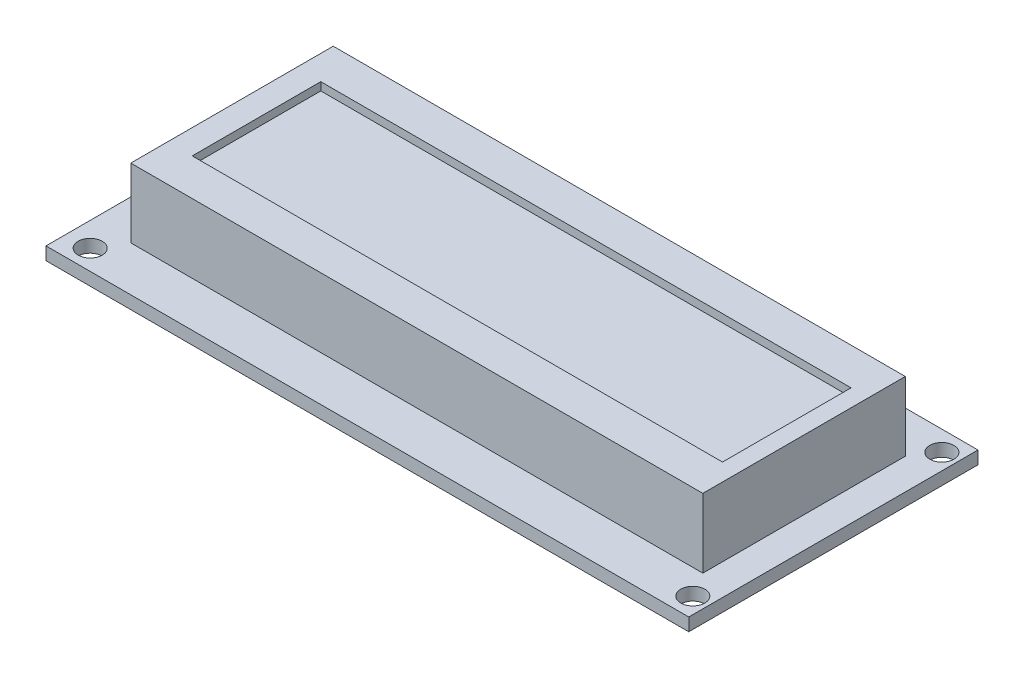
ISO-10303-21;
HEADER;
FILE_DESCRIPTION(('STEP AP214'),'2;1');
FILE_NAME('part.step','',(''),(''),'','','');
FILE_SCHEMA(('AUTOMOTIVE_DESIGN { 1 0 10303 214 1 1 1 1 }'));
ENDSEC;
DATA;
#1=APPLICATION_CONTEXT('core data for automotive mechanical design processes');
#2=APPLICATION_PROTOCOL_DEFINITION('international standard','automotive_design',2000,#1);
#3=PRODUCT_CONTEXT('',#1,'mechanical');
#4=PRODUCT('Part','Part','',(#3));
#5=PRODUCT_RELATED_PRODUCT_CATEGORY('part','',(#4));
#6=PRODUCT_DEFINITION_FORMATION('','',#4);
#7=PRODUCT_DEFINITION_CONTEXT('part definition',#1,'design');
#8=PRODUCT_DEFINITION('design','',#6,#7);
#9=PRODUCT_DEFINITION_SHAPE('','',#8);
#10=(LENGTH_UNIT() NAMED_UNIT(*) SI_UNIT(.MILLI.,.METRE.));
#11=(NAMED_UNIT(*) PLANE_ANGLE_UNIT() SI_UNIT($,.RADIAN.));
#12=(NAMED_UNIT(*) SI_UNIT($,.STERADIAN.) SOLID_ANGLE_UNIT());
#13=UNCERTAINTY_MEASURE_WITH_UNIT(LENGTH_MEASURE(1.E-05),#10,'distance_accuracy_value','');
#14=(GEOMETRIC_REPRESENTATION_CONTEXT(3) GLOBAL_UNCERTAINTY_ASSIGNED_CONTEXT((#13)) GLOBAL_UNIT_ASSIGNED_CONTEXT((#10,
#11,#12)) REPRESENTATION_CONTEXT('',''));
#15=CARTESIAN_POINT('',(0.,0.,0.));
#16=DIRECTION('',(0.,0.,1.));
#17=DIRECTION('',(1.,0.,0.));
#18=AXIS2_PLACEMENT_3D('',#15,#16,#17);
#19=CARTESIAN_POINT('',(0.,1.6,0.));
#20=DIRECTION('',(0.,1.,0.));
#21=DIRECTION('',(0.,0.,1.));
#22=AXIS2_PLACEMENT_3D('',#19,#20,#21);
#23=PLANE('',#22);
#24=CARTESIAN_POINT('',(9.38767123287673,1.6,-25.7191780821918));
#25=DIRECTION('',(0.,1.,0.));
#26=DIRECTION('',(0.,0.,1.));
#27=AXIS2_PLACEMENT_3D('',#24,#25,#26);
#28=CIRCLE('',#27,0.499999999999999);
#29=CARTESIAN_POINT('',(9.38767123287673,1.6,-25.2191780821918));
#30=VERTEX_POINT('',#29);
#31=EDGE_CURVE('E312',#30,#30,#28,.T.);
#32=ORIENTED_EDGE('',*,*,#31,.F.);
#33=EDGE_LOOP('',(#32));
#34=FACE_BOUND('',#33,.T.);
#35=CARTESIAN_POINT('',(6.84767123287673,1.6,-25.7191780821918));
#36=DIRECTION('',(0.,1.,0.));
#37=DIRECTION('',(0.,0.,1.));
#38=AXIS2_PLACEMENT_3D('',#35,#36,#37);
#39=CIRCLE('',#38,0.499999999999999);
#40=CARTESIAN_POINT('',(6.84767123287673,1.6,-25.2191780821918));
#41=VERTEX_POINT('',#40);
#42=EDGE_CURVE('E302',#41,#41,#39,.T.);
#43=ORIENTED_EDGE('',*,*,#42,.F.);
#44=EDGE_LOOP('',(#43));
#45=FACE_BOUND('',#44,.T.);
#46=CARTESIAN_POINT('',(4.30767123287673,1.6,-25.7191780821918));
#47=DIRECTION('',(0.,1.,0.));
#48=DIRECTION('',(0.,0.,1.));
#49=AXIS2_PLACEMENT_3D('',#46,#47,#48);
#50=CIRCLE('',#49,0.499999999999999);
#51=CARTESIAN_POINT('',(4.30767123287673,1.6,-25.2191780821918));
#52=VERTEX_POINT('',#51);
#53=EDGE_CURVE('E299',#52,#52,#50,.T.);
#54=ORIENTED_EDGE('',*,*,#53,.F.);
#55=EDGE_LOOP('',(#54));
#56=FACE_BOUND('',#55,.T.);
#57=CARTESIAN_POINT('',(1.76767123287673,1.6,-25.7191780821918));
#58=DIRECTION('',(0.,1.,0.));
#59=DIRECTION('',(0.,0.,1.));
#60=AXIS2_PLACEMENT_3D('',#57,#58,#59);
#61=CIRCLE('',#60,0.499999999999999);
#62=CARTESIAN_POINT('',(1.76767123287673,1.6,-25.2191780821918));
#63=VERTEX_POINT('',#62);
#64=EDGE_CURVE('E296',#63,#63,#61,.T.);
#65=ORIENTED_EDGE('',*,*,#64,.F.);
#66=EDGE_LOOP('',(#65));
#67=FACE_BOUND('',#66,.T.);
#68=CARTESIAN_POINT('',(-0.772328767123267,1.6,-25.7191780821918));
#69=DIRECTION('',(0.,1.,0.));
#70=DIRECTION('',(0.,0.,1.));
#71=AXIS2_PLACEMENT_3D('',#68,#69,#70);
#72=CIRCLE('',#71,0.499999999999999);
#73=CARTESIAN_POINT('',(-0.772328767123267,1.6,-25.2191780821918));
#74=VERTEX_POINT('',#73);
#75=EDGE_CURVE('E292',#74,#74,#72,.T.);
#76=ORIENTED_EDGE('',*,*,#75,.F.);
#77=EDGE_LOOP('',(#76));
#78=FACE_BOUND('',#77,.T.);
#79=CARTESIAN_POINT('',(-3.31232876712327,1.6,-25.7191780821918));
#80=DIRECTION('',(0.,1.,0.));
#81=DIRECTION('',(0.,0.,1.));
#82=AXIS2_PLACEMENT_3D('',#79,#80,#81);
#83=CIRCLE('',#82,0.499999999999999);
#84=CARTESIAN_POINT('',(-3.31232876712327,1.6,-25.2191780821918));
#85=VERTEX_POINT('',#84);
#86=EDGE_CURVE('E288',#85,#85,#83,.T.);
#87=ORIENTED_EDGE('',*,*,#86,.F.);
#88=EDGE_LOOP('',(#87));
#89=FACE_BOUND('',#88,.T.);
#90=CARTESIAN_POINT('',(-5.85232876712327,1.6,-25.7191780821918));
#91=DIRECTION('',(0.,1.,0.));
#92=DIRECTION('',(0.,0.,1.));
#93=AXIS2_PLACEMENT_3D('',#90,#91,#92);
#94=CIRCLE('',#93,0.499999999999999);
#95=CARTESIAN_POINT('',(-5.85232876712327,1.6,-25.2191780821918));
#96=VERTEX_POINT('',#95);
#97=EDGE_CURVE('E284',#96,#96,#94,.T.);
#98=ORIENTED_EDGE('',*,*,#97,.F.);
#99=EDGE_LOOP('',(#98));
#100=FACE_BOUND('',#99,.T.);
#101=CARTESIAN_POINT('',(-8.39232876712327,1.6,-25.7191780821918));
#102=DIRECTION('',(0.,1.,0.));
#103=DIRECTION('',(0.,0.,1.));
#104=AXIS2_PLACEMENT_3D('',#101,#102,#103);
#105=CIRCLE('',#104,0.499999999999999);
#106=CARTESIAN_POINT('',(-8.39232876712327,1.6,-25.2191780821918));
#107=VERTEX_POINT('',#106);
#108=EDGE_CURVE('E280',#107,#107,#105,.T.);
#109=ORIENTED_EDGE('',*,*,#108,.F.);
#110=EDGE_LOOP('',(#109));
#111=FACE_BOUND('',#110,.T.);
#112=CARTESIAN_POINT('',(-10.9323287671233,1.6,-25.7191780821918));
#113=DIRECTION('',(0.,1.,0.));
#114=DIRECTION('',(0.,0.,1.));
#115=AXIS2_PLACEMENT_3D('',#112,#113,#114);
#116=CIRCLE('',#115,0.499999999999999);
#117=CARTESIAN_POINT('',(-10.9323287671233,1.6,-25.2191780821918));
#118=VERTEX_POINT('',#117);
#119=EDGE_CURVE('E276',#118,#118,#116,.T.);
#120=ORIENTED_EDGE('',*,*,#119,.F.);
#121=EDGE_LOOP('',(#120));
#122=FACE_BOUND('',#121,.T.);
#123=CARTESIAN_POINT('',(-13.4723287671233,1.6,-25.7191780821918));
#124=DIRECTION('',(0.,1.,0.));
#125=DIRECTION('',(0.,0.,1.));
#126=AXIS2_PLACEMENT_3D('',#123,#124,#125);
#127=CIRCLE('',#126,0.499999999999999);
#128=CARTESIAN_POINT('',(-13.4723287671233,1.6,-25.2191780821918));
#129=VERTEX_POINT('',#128);
#130=EDGE_CURVE('E272',#129,#129,#127,.T.);
#131=ORIENTED_EDGE('',*,*,#130,.F.);
#132=EDGE_LOOP('',(#131));
#133=FACE_BOUND('',#132,.T.);
#134=CARTESIAN_POINT('',(-16.0123287671233,1.6,-25.7191780821918));
#135=DIRECTION('',(0.,1.,0.));
#136=DIRECTION('',(0.,0.,1.));
#137=AXIS2_PLACEMENT_3D('',#134,#135,#136);
#138=CIRCLE('',#137,0.499999999999998);
#139=CARTESIAN_POINT('',(-16.0123287671233,1.6,-25.2191780821918));
#140=VERTEX_POINT('',#139);
#141=EDGE_CURVE('E268',#140,#140,#138,.T.);
#142=ORIENTED_EDGE('',*,*,#141,.F.);
#143=EDGE_LOOP('',(#142));
#144=FACE_BOUND('',#143,.T.);
#145=CARTESIAN_POINT('',(-18.5523287671233,1.6,-25.7191780821918));
#146=DIRECTION('',(0.,1.,0.));
#147=DIRECTION('',(0.,0.,1.));
#148=AXIS2_PLACEMENT_3D('',#145,#146,#147);
#149=CIRCLE('',#148,0.499999999999999);
#150=CARTESIAN_POINT('',(-18.5523287671233,1.6,-25.2191780821918));
#151=VERTEX_POINT('',#150);
#152=EDGE_CURVE('E264',#151,#151,#149,.T.);
#153=ORIENTED_EDGE('',*,*,#152,.F.);
#154=EDGE_LOOP('',(#153));
#155=FACE_BOUND('',#154,.T.);
#156=CARTESIAN_POINT('',(-21.0923287671233,1.6,-25.7191780821918));
#157=DIRECTION('',(0.,1.,0.));
#158=DIRECTION('',(0.,0.,1.));
#159=AXIS2_PLACEMENT_3D('',#156,#157,#158);
#160=CIRCLE('',#159,0.499999999999999);
#161=CARTESIAN_POINT('',(-21.0923287671233,1.6,-25.2191780821918));
#162=VERTEX_POINT('',#161);
#163=EDGE_CURVE('E260',#162,#162,#160,.T.);
#164=ORIENTED_EDGE('',*,*,#163,.F.);
#165=EDGE_LOOP('',(#164));
#166=FACE_BOUND('',#165,.T.);
#167=CARTESIAN_POINT('',(-23.6323287671233,1.6,-25.7191780821918));
#168=DIRECTION('',(0.,1.,0.));
#169=DIRECTION('',(0.,0.,1.));
#170=AXIS2_PLACEMENT_3D('',#167,#168,#169);
#171=CIRCLE('',#170,0.499999999999999);
#172=CARTESIAN_POINT('',(-23.6323287671233,1.6,-25.2191780821918));
#173=VERTEX_POINT('',#172);
#174=EDGE_CURVE('E256',#173,#173,#171,.T.);
#175=ORIENTED_EDGE('',*,*,#174,.F.);
#176=EDGE_LOOP('',(#175));
#177=FACE_BOUND('',#176,.T.);
#178=CARTESIAN_POINT('',(-26.1723287671233,1.6,-25.7191780821918));
#179=DIRECTION('',(0.,1.,0.));
#180=DIRECTION('',(0.,0.,1.));
#181=AXIS2_PLACEMENT_3D('',#178,#179,#180);
#182=CIRCLE('',#181,0.499999999999999);
#183=CARTESIAN_POINT('',(-26.1723287671233,1.6,-25.2191780821918));
#184=VERTEX_POINT('',#183);
#185=EDGE_CURVE('E252',#184,#184,#182,.T.);
#186=ORIENTED_EDGE('',*,*,#185,.F.);
#187=EDGE_LOOP('',(#186));
#188=FACE_BOUND('',#187,.T.);
#189=CARTESIAN_POINT('',(-28.7123287671233,1.6,-25.7191780821918));
#190=DIRECTION('',(0.,1.,0.));
#191=DIRECTION('',(0.,0.,1.));
#192=AXIS2_PLACEMENT_3D('',#189,#190,#191);
#193=CIRCLE('',#192,0.499999999999999);
#194=CARTESIAN_POINT('',(-28.7123287671233,1.6,-25.2191780821918));
#195=VERTEX_POINT('',#194);
#196=EDGE_CURVE('E154',#195,#195,#193,.T.);
#197=ORIENTED_EDGE('',*,*,#196,.F.);
#198=EDGE_LOOP('',(#197));
#199=FACE_BOUND('',#198,.T.);
#200=CARTESIAN_POINT('',(41.2876712328767,1.6,5.2808219178082));
#201=DIRECTION('',(0.,1.,0.));
#202=DIRECTION('',(0.,0.,1.));
#203=AXIS2_PLACEMENT_3D('',#200,#201,#202);
#204=CIRCLE('',#203,1.5);
#205=CARTESIAN_POINT('',(41.2876712328767,1.6,6.7808219178082));
#206=VERTEX_POINT('',#205);
#207=EDGE_CURVE('E167',#206,#206,#204,.T.);
#208=ORIENTED_EDGE('',*,*,#207,.F.);
#209=EDGE_LOOP('',(#208));
#210=FACE_BOUND('',#209,.T.);
#211=CARTESIAN_POINT('',(-33.7123287671233,1.6,5.2808219178082));
#212=DIRECTION('',(0.,1.,0.));
#213=DIRECTION('',(0.,0.,1.));
#214=AXIS2_PLACEMENT_3D('',#211,#212,#213);
#215=CIRCLE('',#214,1.5);
#216=CARTESIAN_POINT('',(-33.7123287671233,1.6,6.7808219178082));
#217=VERTEX_POINT('',#216);
#218=EDGE_CURVE('E174',#217,#217,#215,.T.);
#219=ORIENTED_EDGE('',*,*,#218,.F.);
#220=EDGE_LOOP('',(#219));
#221=FACE_BOUND('',#220,.T.);
#222=CARTESIAN_POINT('',(41.2876712328767,1.6,-25.7191780821918));
#223=DIRECTION('',(0.,1.,0.));
#224=DIRECTION('',(0.,0.,1.));
#225=AXIS2_PLACEMENT_3D('',#222,#223,#224);
#226=CIRCLE('',#225,1.5);
#227=CARTESIAN_POINT('',(41.2876712328767,1.6,-24.2191780821918));
#228=VERTEX_POINT('',#227);
#229=EDGE_CURVE('E178',#228,#228,#226,.T.);
#230=ORIENTED_EDGE('',*,*,#229,.F.);
#231=EDGE_LOOP('',(#230));
#232=FACE_BOUND('',#231,.T.);
#233=CARTESIAN_POINT('',(-33.7123287671233,1.6,-25.7191780821918));
#234=DIRECTION('',(0.,1.,0.));
#235=DIRECTION('',(0.,0.,1.));
#236=AXIS2_PLACEMENT_3D('',#233,#234,#235);
#237=CIRCLE('',#236,1.5);
#238=CARTESIAN_POINT('',(-33.7123287671233,1.6,-24.2191780821918));
#239=VERTEX_POINT('',#238);
#240=EDGE_CURVE('E182',#239,#239,#237,.T.);
#241=ORIENTED_EDGE('',*,*,#240,.F.);
#242=EDGE_LOOP('',(#241));
#243=FACE_BOUND('',#242,.T.);
#244=DIRECTION('',(0.,0.,1.));
#245=VECTOR('',#244,1.);
#246=CARTESIAN_POINT('',(-36.7123287671233,1.6,-28.2191780821918));
#247=LINE('',#246,#245);
#248=CARTESIAN_POINT('',(-36.7123287671233,1.6,-28.2191780821918));
#249=VERTEX_POINT('',#248);
#250=CARTESIAN_POINT('',(-36.7123287671233,1.6,7.78082191780819));
#251=VERTEX_POINT('',#250);
#252=EDGE_CURVE('E214',#249,#251,#247,.T.);
#253=ORIENTED_EDGE('',*,*,#252,.T.);
#254=DIRECTION('',(1.,0.,0.));
#255=VECTOR('',#254,1.);
#256=CARTESIAN_POINT('',(-36.7123287671233,1.6,7.78082191780819));
#257=LINE('',#256,#255);
#258=CARTESIAN_POINT('',(43.2876712328767,1.6,7.78082191780819));
#259=VERTEX_POINT('',#258);
#260=EDGE_CURVE('E217',#251,#259,#257,.T.);
#261=ORIENTED_EDGE('',*,*,#260,.T.);
#262=DIRECTION('',(0.,0.,-1.));
#263=VECTOR('',#262,1.);
#264=CARTESIAN_POINT('',(43.2876712328767,1.6,-28.2191780821918));
#265=LINE('',#264,#263);
#266=CARTESIAN_POINT('',(43.2876712328767,1.6,-28.2191780821918));
#267=VERTEX_POINT('',#266);
#268=EDGE_CURVE('E220',#259,#267,#265,.T.);
#269=ORIENTED_EDGE('',*,*,#268,.T.);
#270=DIRECTION('',(-1.,0.,0.));
#271=VECTOR('',#270,1.);
#272=CARTESIAN_POINT('',(-36.7123287671233,1.6,-28.2191780821918));
#273=LINE('',#272,#271);
#274=EDGE_CURVE('E222',#267,#249,#273,.T.);
#275=ORIENTED_EDGE('',*,*,#274,.T.);
#276=EDGE_LOOP('',(#253,#261,#269,#275));
#277=FACE_BOUND('',#276,.T.);
#278=DIRECTION('',(1.,0.,0.));
#279=VECTOR('',#278,1.);
#280=CARTESIAN_POINT('',(-31.7623287671233,1.6,2.1808219178082));
#281=LINE('',#280,#279);
#282=CARTESIAN_POINT('',(-31.7623287671233,1.6,2.1808219178082));
#283=VERTEX_POINT('',#282);
#284=CARTESIAN_POINT('',(39.4376712328767,1.6,2.1808219178082));
#285=VERTEX_POINT('',#284);
#286=EDGE_CURVE('E200',#283,#285,#281,.T.);
#287=ORIENTED_EDGE('',*,*,#286,.F.);
#288=DIRECTION('',(0.,0.,1.));
#289=VECTOR('',#288,1.);
#290=CARTESIAN_POINT('',(-31.7623287671233,1.6,-23.0191780821918));
#291=LINE('',#290,#289);
#292=CARTESIAN_POINT('',(-31.7623287671233,1.6,-23.0191780821918));
#293=VERTEX_POINT('',#292);
#294=EDGE_CURVE('E197',#293,#283,#291,.T.);
#295=ORIENTED_EDGE('',*,*,#294,.F.);
#296=DIRECTION('',(-1.,0.,0.));
#297=VECTOR('',#296,1.);
#298=CARTESIAN_POINT('',(-31.7623287671233,1.6,-23.0191780821918));
#299=LINE('',#298,#297);
#300=CARTESIAN_POINT('',(39.4376712328767,1.6,-23.0191780821918));
#301=VERTEX_POINT('',#300);
#302=EDGE_CURVE('E190',#301,#293,#299,.T.);
#303=ORIENTED_EDGE('',*,*,#302,.F.);
#304=DIRECTION('',(0.,0.,-1.));
#305=VECTOR('',#304,1.);
#306=CARTESIAN_POINT('',(39.4376712328767,1.6,-23.0191780821918));
#307=LINE('',#306,#305);
#308=EDGE_CURVE('E202',#285,#301,#307,.T.);
#309=ORIENTED_EDGE('',*,*,#308,.F.);
#310=EDGE_LOOP('',(#287,#295,#303,#309));
#311=FACE_BOUND('',#310,.T.);
#312=ADVANCED_FACE('F36',(#34,#45,#56,#67,#78,#89,#100,#111,#122,#133,#144,#155,#166,#177,#188,
#199,#210,#221,#232,#243,#277,#311),#23,.T.);
#313=CARTESIAN_POINT('',(-36.7123287671233,1.6,-28.2191780821918));
#314=DIRECTION('',(1.,0.,0.));
#315=DIRECTION('',(0.,0.,-1.));
#316=AXIS2_PLACEMENT_3D('',#313,#314,#315);
#317=PLANE('',#316);
#318=DIRECTION('',(0.,0.,1.));
#319=VECTOR('',#318,1.);
#320=CARTESIAN_POINT('',(-36.7123287671233,0.,-28.2191780821918));
#321=LINE('',#320,#319);
#322=CARTESIAN_POINT('',(-36.7123287671233,0.,-28.2191780821918));
#323=VERTEX_POINT('',#322);
#324=CARTESIAN_POINT('',(-36.7123287671233,0.,7.78082191780819));
#325=VERTEX_POINT('',#324);
#326=EDGE_CURVE('E213',#323,#325,#321,.T.);
#327=ORIENTED_EDGE('',*,*,#326,.T.);
#328=DIRECTION('',(0.,-1.,0.));
#329=VECTOR('',#328,1.);
#330=CARTESIAN_POINT('',(-36.7123287671233,1.6,7.78082191780819));
#331=LINE('',#330,#329);
#332=EDGE_CURVE('E11',#251,#325,#331,.T.);
#333=ORIENTED_EDGE('',*,*,#332,.F.);
#334=ORIENTED_EDGE('',*,*,#252,.F.);
#335=DIRECTION('',(0.,-1.,0.));
#336=VECTOR('',#335,1.);
#337=CARTESIAN_POINT('',(-36.7123287671233,1.6,-28.2191780821918));
#338=LINE('',#337,#336);
#339=EDGE_CURVE('E224',#249,#323,#338,.T.);
#340=ORIENTED_EDGE('',*,*,#339,.T.);
#341=EDGE_LOOP('',(#327,#333,#334,#340));
#342=FACE_BOUND('',#341,.T.);
#343=ADVANCED_FACE('F38',(#342),#317,.F.);
#344=CARTESIAN_POINT('',(-36.7123287671233,1.6,7.78082191780819));
#345=DIRECTION('',(0.,0.,-1.));
#346=DIRECTION('',(-1.,0.,0.));
#347=AXIS2_PLACEMENT_3D('',#344,#345,#346);
#348=PLANE('',#347);
#349=DIRECTION('',(1.,0.,0.));
#350=VECTOR('',#349,1.);
#351=CARTESIAN_POINT('',(-36.7123287671233,0.,7.78082191780819));
#352=LINE('',#351,#350);
#353=CARTESIAN_POINT('',(43.2876712328767,0.,7.78082191780819));
#354=VERTEX_POINT('',#353);
#355=EDGE_CURVE('E227',#325,#354,#352,.T.);
#356=ORIENTED_EDGE('',*,*,#355,.T.);
#357=DIRECTION('',(0.,-1.,0.));
#358=VECTOR('',#357,1.);
#359=CARTESIAN_POINT('',(43.2876712328767,1.6,7.78082191780819));
#360=LINE('',#359,#358);
#361=EDGE_CURVE('E45',#259,#354,#360,.T.);
#362=ORIENTED_EDGE('',*,*,#361,.F.);
#363=ORIENTED_EDGE('',*,*,#260,.F.);
#364=ORIENTED_EDGE('',*,*,#332,.T.);
#365=EDGE_LOOP('',(#356,#362,#363,#364));
#366=FACE_BOUND('',#365,.T.);
#367=ADVANCED_FACE('F404',(#366),#348,.F.);
#368=CARTESIAN_POINT('',(43.2876712328767,1.6,-28.2191780821918));
#369=DIRECTION('',(-1.,0.,0.));
#370=DIRECTION('',(0.,0.,1.));
#371=AXIS2_PLACEMENT_3D('',#368,#369,#370);
#372=PLANE('',#371);
#373=DIRECTION('',(0.,0.,-1.));
#374=VECTOR('',#373,1.);
#375=CARTESIAN_POINT('',(43.2876712328767,0.,-28.2191780821918));
#376=LINE('',#375,#374);
#377=CARTESIAN_POINT('',(43.2876712328767,0.,-28.2191780821918));
#378=VERTEX_POINT('',#377);
#379=EDGE_CURVE('E229',#354,#378,#376,.T.);
#380=ORIENTED_EDGE('',*,*,#379,.T.);
#381=DIRECTION('',(0.,-1.,0.));
#382=VECTOR('',#381,1.);
#383=CARTESIAN_POINT('',(43.2876712328767,1.6,-28.2191780821918));
#384=LINE('',#383,#382);
#385=EDGE_CURVE('E234',#267,#378,#384,.T.);
#386=ORIENTED_EDGE('',*,*,#385,.F.);
#387=ORIENTED_EDGE('',*,*,#268,.F.);
#388=ORIENTED_EDGE('',*,*,#361,.T.);
#389=EDGE_LOOP('',(#380,#386,#387,#388));
#390=FACE_BOUND('',#389,.T.);
#391=ADVANCED_FACE('F401',(#390),#372,.F.);
#392=CARTESIAN_POINT('',(-36.7123287671233,1.6,-28.2191780821918));
#393=DIRECTION('',(0.,0.,1.));
#394=DIRECTION('',(1.,0.,0.));
#395=AXIS2_PLACEMENT_3D('',#392,#393,#394);
#396=PLANE('',#395);
#397=DIRECTION('',(-1.,0.,0.));
#398=VECTOR('',#397,1.);
#399=CARTESIAN_POINT('',(-36.7123287671233,0.,-28.2191780821918));
#400=LINE('',#399,#398);
#401=EDGE_CURVE('E218',#378,#323,#400,.T.);
#402=ORIENTED_EDGE('',*,*,#401,.T.);
#403=ORIENTED_EDGE('',*,*,#339,.F.);
#404=ORIENTED_EDGE('',*,*,#274,.F.);
#405=ORIENTED_EDGE('',*,*,#385,.T.);
#406=EDGE_LOOP('',(#402,#403,#404,#405));
#407=FACE_BOUND('',#406,.T.);
#408=ADVANCED_FACE('F397',(#407),#396,.F.);
#409=CARTESIAN_POINT('',(0.,0.,0.));
#410=DIRECTION('',(0.,1.,0.));
#411=DIRECTION('',(0.,0.,1.));
#412=AXIS2_PLACEMENT_3D('',#409,#410,#411);
#413=PLANE('',#412);
#414=CARTESIAN_POINT('',(9.38767123287673,0.,-25.7191780821918));
#415=DIRECTION('',(0.,1.,0.));
#416=DIRECTION('',(0.,0.,1.));
#417=AXIS2_PLACEMENT_3D('',#414,#415,#416);
#418=CIRCLE('',#417,0.499999999999999);
#419=CARTESIAN_POINT('',(9.38767123287673,0.,-25.2191780821918));
#420=VERTEX_POINT('',#419);
#421=EDGE_CURVE('E40',#420,#420,#418,.T.);
#422=ORIENTED_EDGE('',*,*,#421,.T.);
#423=EDGE_LOOP('',(#422));
#424=FACE_BOUND('',#423,.T.);
#425=CARTESIAN_POINT('',(6.84767123287673,0.,-25.7191780821918));
#426=DIRECTION('',(0.,1.,0.));
#427=DIRECTION('',(0.,0.,1.));
#428=AXIS2_PLACEMENT_3D('',#425,#426,#427);
#429=CIRCLE('',#428,0.499999999999999);
#430=CARTESIAN_POINT('',(6.84767123287673,0.,-25.2191780821918));
#431=VERTEX_POINT('',#430);
#432=EDGE_CURVE('E300',#431,#431,#429,.T.);
#433=ORIENTED_EDGE('',*,*,#432,.T.);
#434=EDGE_LOOP('',(#433));
#435=FACE_BOUND('',#434,.T.);
#436=CARTESIAN_POINT('',(4.30767123287673,0.,-25.7191780821918));
#437=DIRECTION('',(0.,1.,0.));
#438=DIRECTION('',(0.,0.,1.));
#439=AXIS2_PLACEMENT_3D('',#436,#437,#438);
#440=CIRCLE('',#439,0.499999999999999);
#441=CARTESIAN_POINT('',(4.30767123287673,0.,-25.2191780821918));
#442=VERTEX_POINT('',#441);
#443=EDGE_CURVE('E297',#442,#442,#440,.T.);
#444=ORIENTED_EDGE('',*,*,#443,.T.);
#445=EDGE_LOOP('',(#444));
#446=FACE_BOUND('',#445,.T.);
#447=CARTESIAN_POINT('',(1.76767123287673,0.,-25.7191780821918));
#448=DIRECTION('',(0.,1.,0.));
#449=DIRECTION('',(0.,0.,1.));
#450=AXIS2_PLACEMENT_3D('',#447,#448,#449);
#451=CIRCLE('',#450,0.499999999999999);
#452=CARTESIAN_POINT('',(1.76767123287673,0.,-25.2191780821918));
#453=VERTEX_POINT('',#452);
#454=EDGE_CURVE('E293',#453,#453,#451,.T.);
#455=ORIENTED_EDGE('',*,*,#454,.T.);
#456=EDGE_LOOP('',(#455));
#457=FACE_BOUND('',#456,.T.);
#458=CARTESIAN_POINT('',(-0.772328767123267,0.,-25.7191780821918));
#459=DIRECTION('',(0.,1.,0.));
#460=DIRECTION('',(0.,0.,1.));
#461=AXIS2_PLACEMENT_3D('',#458,#459,#460);
#462=CIRCLE('',#461,0.499999999999999);
#463=CARTESIAN_POINT('',(-0.772328767123267,0.,-25.2191780821918));
#464=VERTEX_POINT('',#463);
#465=EDGE_CURVE('E289',#464,#464,#462,.T.);
#466=ORIENTED_EDGE('',*,*,#465,.T.);
#467=EDGE_LOOP('',(#466));
#468=FACE_BOUND('',#467,.T.);
#469=CARTESIAN_POINT('',(-3.31232876712327,0.,-25.7191780821918));
#470=DIRECTION('',(0.,1.,0.));
#471=DIRECTION('',(0.,0.,1.));
#472=AXIS2_PLACEMENT_3D('',#469,#470,#471);
#473=CIRCLE('',#472,0.499999999999999);
#474=CARTESIAN_POINT('',(-3.31232876712327,0.,-25.2191780821918));
#475=VERTEX_POINT('',#474);
#476=EDGE_CURVE('E285',#475,#475,#473,.T.);
#477=ORIENTED_EDGE('',*,*,#476,.T.);
#478=EDGE_LOOP('',(#477));
#479=FACE_BOUND('',#478,.T.);
#480=CARTESIAN_POINT('',(-5.85232876712327,0.,-25.7191780821918));
#481=DIRECTION('',(0.,1.,0.));
#482=DIRECTION('',(0.,0.,1.));
#483=AXIS2_PLACEMENT_3D('',#480,#481,#482);
#484=CIRCLE('',#483,0.499999999999999);
#485=CARTESIAN_POINT('',(-5.85232876712327,0.,-25.2191780821918));
#486=VERTEX_POINT('',#485);
#487=EDGE_CURVE('E281',#486,#486,#484,.T.);
#488=ORIENTED_EDGE('',*,*,#487,.T.);
#489=EDGE_LOOP('',(#488));
#490=FACE_BOUND('',#489,.T.);
#491=CARTESIAN_POINT('',(-8.39232876712327,0.,-25.7191780821918));
#492=DIRECTION('',(0.,1.,0.));
#493=DIRECTION('',(0.,0.,1.));
#494=AXIS2_PLACEMENT_3D('',#491,#492,#493);
#495=CIRCLE('',#494,0.499999999999999);
#496=CARTESIAN_POINT('',(-8.39232876712327,0.,-25.2191780821918));
#497=VERTEX_POINT('',#496);
#498=EDGE_CURVE('E277',#497,#497,#495,.T.);
#499=ORIENTED_EDGE('',*,*,#498,.T.);
#500=EDGE_LOOP('',(#499));
#501=FACE_BOUND('',#500,.T.);
#502=CARTESIAN_POINT('',(-10.9323287671233,0.,-25.7191780821918));
#503=DIRECTION('',(0.,1.,0.));
#504=DIRECTION('',(0.,0.,1.));
#505=AXIS2_PLACEMENT_3D('',#502,#503,#504);
#506=CIRCLE('',#505,0.499999999999999);
#507=CARTESIAN_POINT('',(-10.9323287671233,0.,-25.2191780821918));
#508=VERTEX_POINT('',#507);
#509=EDGE_CURVE('E273',#508,#508,#506,.T.);
#510=ORIENTED_EDGE('',*,*,#509,.T.);
#511=EDGE_LOOP('',(#510));
#512=FACE_BOUND('',#511,.T.);
#513=CARTESIAN_POINT('',(-13.4723287671233,0.,-25.7191780821918));
#514=DIRECTION('',(0.,1.,0.));
#515=DIRECTION('',(0.,0.,1.));
#516=AXIS2_PLACEMENT_3D('',#513,#514,#515);
#517=CIRCLE('',#516,0.499999999999999);
#518=CARTESIAN_POINT('',(-13.4723287671233,0.,-25.2191780821918));
#519=VERTEX_POINT('',#518);
#520=EDGE_CURVE('E269',#519,#519,#517,.T.);
#521=ORIENTED_EDGE('',*,*,#520,.T.);
#522=EDGE_LOOP('',(#521));
#523=FACE_BOUND('',#522,.T.);
#524=CARTESIAN_POINT('',(-16.0123287671233,0.,-25.7191780821918));
#525=DIRECTION('',(0.,1.,0.));
#526=DIRECTION('',(0.,0.,1.));
#527=AXIS2_PLACEMENT_3D('',#524,#525,#526);
#528=CIRCLE('',#527,0.499999999999998);
#529=CARTESIAN_POINT('',(-16.0123287671233,0.,-25.2191780821918));
#530=VERTEX_POINT('',#529);
#531=EDGE_CURVE('E265',#530,#530,#528,.T.);
#532=ORIENTED_EDGE('',*,*,#531,.T.);
#533=EDGE_LOOP('',(#532));
#534=FACE_BOUND('',#533,.T.);
#535=CARTESIAN_POINT('',(-18.5523287671233,0.,-25.7191780821918));
#536=DIRECTION('',(0.,1.,0.));
#537=DIRECTION('',(0.,0.,1.));
#538=AXIS2_PLACEMENT_3D('',#535,#536,#537);
#539=CIRCLE('',#538,0.499999999999999);
#540=CARTESIAN_POINT('',(-18.5523287671233,0.,-25.2191780821918));
#541=VERTEX_POINT('',#540);
#542=EDGE_CURVE('E261',#541,#541,#539,.T.);
#543=ORIENTED_EDGE('',*,*,#542,.T.);
#544=EDGE_LOOP('',(#543));
#545=FACE_BOUND('',#544,.T.);
#546=CARTESIAN_POINT('',(-21.0923287671233,0.,-25.7191780821918));
#547=DIRECTION('',(0.,1.,0.));
#548=DIRECTION('',(0.,0.,1.));
#549=AXIS2_PLACEMENT_3D('',#546,#547,#548);
#550=CIRCLE('',#549,0.499999999999999);
#551=CARTESIAN_POINT('',(-21.0923287671233,0.,-25.2191780821918));
#552=VERTEX_POINT('',#551);
#553=EDGE_CURVE('E257',#552,#552,#550,.T.);
#554=ORIENTED_EDGE('',*,*,#553,.T.);
#555=EDGE_LOOP('',(#554));
#556=FACE_BOUND('',#555,.T.);
#557=CARTESIAN_POINT('',(-23.6323287671233,0.,-25.7191780821918));
#558=DIRECTION('',(0.,1.,0.));
#559=DIRECTION('',(0.,0.,1.));
#560=AXIS2_PLACEMENT_3D('',#557,#558,#559);
#561=CIRCLE('',#560,0.499999999999999);
#562=CARTESIAN_POINT('',(-23.6323287671233,0.,-25.2191780821918));
#563=VERTEX_POINT('',#562);
#564=EDGE_CURVE('E253',#563,#563,#561,.T.);
#565=ORIENTED_EDGE('',*,*,#564,.T.);
#566=EDGE_LOOP('',(#565));
#567=FACE_BOUND('',#566,.T.);
#568=CARTESIAN_POINT('',(-26.1723287671233,0.,-25.7191780821918));
#569=DIRECTION('',(0.,1.,0.));
#570=DIRECTION('',(0.,0.,1.));
#571=AXIS2_PLACEMENT_3D('',#568,#569,#570);
#572=CIRCLE('',#571,0.499999999999999);
#573=CARTESIAN_POINT('',(-26.1723287671233,0.,-25.2191780821918));
#574=VERTEX_POINT('',#573);
#575=EDGE_CURVE('E249',#574,#574,#572,.T.);
#576=ORIENTED_EDGE('',*,*,#575,.T.);
#577=EDGE_LOOP('',(#576));
#578=FACE_BOUND('',#577,.T.);
#579=CARTESIAN_POINT('',(-28.7123287671233,0.,-25.7191780821918));
#580=DIRECTION('',(0.,1.,0.));
#581=DIRECTION('',(0.,0.,1.));
#582=AXIS2_PLACEMENT_3D('',#579,#580,#581);
#583=CIRCLE('',#582,0.499999999999999);
#584=CARTESIAN_POINT('',(-28.7123287671233,0.,-25.2191780821918));
#585=VERTEX_POINT('',#584);
#586=EDGE_CURVE('E161',#585,#585,#583,.T.);
#587=ORIENTED_EDGE('',*,*,#586,.T.);
#588=EDGE_LOOP('',(#587));
#589=FACE_BOUND('',#588,.T.);
#590=CARTESIAN_POINT('',(41.2876712328767,0.,5.2808219178082));
#591=DIRECTION('',(0.,1.,0.));
#592=DIRECTION('',(0.,0.,1.));
#593=AXIS2_PLACEMENT_3D('',#590,#591,#592);
#594=CIRCLE('',#593,1.5);
#595=CARTESIAN_POINT('',(41.2876712328767,0.,6.7808219178082));
#596=VERTEX_POINT('',#595);
#597=EDGE_CURVE('E173',#596,#596,#594,.T.);
#598=ORIENTED_EDGE('',*,*,#597,.T.);
#599=EDGE_LOOP('',(#598));
#600=FACE_BOUND('',#599,.T.);
#601=CARTESIAN_POINT('',(-33.7123287671233,0.,5.2808219178082));
#602=DIRECTION('',(0.,1.,0.));
#603=DIRECTION('',(0.,0.,1.));
#604=AXIS2_PLACEMENT_3D('',#601,#602,#603);
#605=CIRCLE('',#604,1.5);
#606=CARTESIAN_POINT('',(-33.7123287671233,0.,6.7808219178082));
#607=VERTEX_POINT('',#606);
#608=EDGE_CURVE('E177',#607,#607,#605,.T.);
#609=ORIENTED_EDGE('',*,*,#608,.T.);
#610=EDGE_LOOP('',(#609));
#611=FACE_BOUND('',#610,.T.);
#612=CARTESIAN_POINT('',(41.2876712328767,0.,-25.7191780821918));
#613=DIRECTION('',(0.,1.,0.));
#614=DIRECTION('',(0.,0.,1.));
#615=AXIS2_PLACEMENT_3D('',#612,#613,#614);
#616=CIRCLE('',#615,1.5);
#617=CARTESIAN_POINT('',(41.2876712328767,0.,-24.2191780821918));
#618=VERTEX_POINT('',#617);
#619=EDGE_CURVE('E181',#618,#618,#616,.T.);
#620=ORIENTED_EDGE('',*,*,#619,.T.);
#621=EDGE_LOOP('',(#620));
#622=FACE_BOUND('',#621,.T.);
#623=CARTESIAN_POINT('',(-33.7123287671233,0.,-25.7191780821918));
#624=DIRECTION('',(0.,1.,0.));
#625=DIRECTION('',(0.,0.,1.));
#626=AXIS2_PLACEMENT_3D('',#623,#624,#625);
#627=CIRCLE('',#626,1.5);
#628=CARTESIAN_POINT('',(-33.7123287671233,0.,-24.2191780821918));
#629=VERTEX_POINT('',#628);
#630=EDGE_CURVE('E185',#629,#629,#627,.T.);
#631=ORIENTED_EDGE('',*,*,#630,.T.);
#632=EDGE_LOOP('',(#631));
#633=FACE_BOUND('',#632,.T.);
#634=ORIENTED_EDGE('',*,*,#326,.F.);
#635=ORIENTED_EDGE('',*,*,#401,.F.);
#636=ORIENTED_EDGE('',*,*,#379,.F.);
#637=ORIENTED_EDGE('',*,*,#355,.F.);
#638=EDGE_LOOP('',(#634,#635,#636,#637));
#639=FACE_BOUND('',#638,.T.);
#640=ADVANCED_FACE('F393',(#424,#435,#446,#457,#468,#479,#490,#501,#512,#523,#534,#545,#556,
#567,#578,#589,#600,#611,#622,#633,#639),#413,.F.);
#641=CARTESIAN_POINT('',(-31.7623287671233,10.2,-23.0191780821918));
#642=DIRECTION('',(1.,0.,0.));
#643=DIRECTION('',(0.,0.,-1.));
#644=AXIS2_PLACEMENT_3D('',#641,#642,#643);
#645=PLANE('',#644);
#646=ORIENTED_EDGE('',*,*,#294,.T.);
#647=DIRECTION('',(0.,-1.,0.));
#648=VECTOR('',#647,1.);
#649=CARTESIAN_POINT('',(-31.7623287671233,10.2,2.1808219178082));
#650=LINE('',#649,#648);
#651=CARTESIAN_POINT('',(-31.7623287671233,10.2,2.1808219178082));
#652=VERTEX_POINT('',#651);
#653=EDGE_CURVE('E211',#652,#283,#650,.T.);
#654=ORIENTED_EDGE('',*,*,#653,.F.);
#655=DIRECTION('',(0.,0.,1.));
#656=VECTOR('',#655,1.);
#657=CARTESIAN_POINT('',(-31.7623287671233,10.2,-23.0191780821918));
#658=LINE('',#657,#656);
#659=CARTESIAN_POINT('',(-31.7623287671233,10.2,-23.0191780821918));
#660=VERTEX_POINT('',#659);
#661=EDGE_CURVE('E186',#660,#652,#658,.T.);
#662=ORIENTED_EDGE('',*,*,#661,.F.);
#663=DIRECTION('',(0.,-1.,0.));
#664=VECTOR('',#663,1.);
#665=CARTESIAN_POINT('',(-31.7623287671233,10.2,-23.0191780821918));
#666=LINE('',#665,#664);
#667=EDGE_CURVE('E196',#660,#293,#666,.T.);
#668=ORIENTED_EDGE('',*,*,#667,.T.);
#669=EDGE_LOOP('',(#646,#654,#662,#668));
#670=FACE_BOUND('',#669,.T.);
#671=ADVANCED_FACE('F376',(#670),#645,.F.);
#672=CARTESIAN_POINT('',(-31.7623287671233,10.2,2.1808219178082));
#673=DIRECTION('',(0.,0.,-1.));
#674=DIRECTION('',(-1.,0.,0.));
#675=AXIS2_PLACEMENT_3D('',#672,#673,#674);
#676=PLANE('',#675);
#677=ORIENTED_EDGE('',*,*,#286,.T.);
#678=DIRECTION('',(0.,-1.,0.));
#679=VECTOR('',#678,1.);
#680=CARTESIAN_POINT('',(39.4376712328767,10.2,2.1808219178082));
#681=LINE('',#680,#679);
#682=CARTESIAN_POINT('',(39.4376712328767,10.2,2.1808219178082));
#683=VERTEX_POINT('',#682);
#684=EDGE_CURVE('E208',#683,#285,#681,.T.);
#685=ORIENTED_EDGE('',*,*,#684,.F.);
#686=DIRECTION('',(1.,0.,0.));
#687=VECTOR('',#686,1.);
#688=CARTESIAN_POINT('',(-31.7623287671233,10.2,2.1808219178082));
#689=LINE('',#688,#687);
#690=EDGE_CURVE('E189',#652,#683,#689,.T.);
#691=ORIENTED_EDGE('',*,*,#690,.F.);
#692=ORIENTED_EDGE('',*,*,#653,.T.);
#693=EDGE_LOOP('',(#677,#685,#691,#692));
#694=FACE_BOUND('',#693,.T.);
#695=ADVANCED_FACE('F366',(#694),#676,.F.);
#696=CARTESIAN_POINT('',(39.4376712328767,10.2,-23.0191780821918));
#697=DIRECTION('',(-1.,0.,0.));
#698=DIRECTION('',(0.,0.,1.));
#699=AXIS2_PLACEMENT_3D('',#696,#697,#698);
#700=PLANE('',#699);
#701=ORIENTED_EDGE('',*,*,#308,.T.);
#702=DIRECTION('',(0.,-1.,0.));
#703=VECTOR('',#702,1.);
#704=CARTESIAN_POINT('',(39.4376712328767,10.2,-23.0191780821918));
#705=LINE('',#704,#703);
#706=CARTESIAN_POINT('',(39.4376712328767,10.2,-23.0191780821918));
#707=VERTEX_POINT('',#706);
#708=EDGE_CURVE('E61',#707,#301,#705,.T.);
#709=ORIENTED_EDGE('',*,*,#708,.F.);
#710=DIRECTION('',(0.,0.,-1.));
#711=VECTOR('',#710,1.);
#712=CARTESIAN_POINT('',(39.4376712328767,10.2,-23.0191780821918));
#713=LINE('',#712,#711);
#714=EDGE_CURVE('E192',#683,#707,#713,.T.);
#715=ORIENTED_EDGE('',*,*,#714,.F.);
#716=ORIENTED_EDGE('',*,*,#684,.T.);
#717=EDGE_LOOP('',(#701,#709,#715,#716));
#718=FACE_BOUND('',#717,.T.);
#719=ADVANCED_FACE('F370',(#718),#700,.F.);
#720=CARTESIAN_POINT('',(-31.7623287671233,10.2,-23.0191780821918));
#721=DIRECTION('',(0.,0.,1.));
#722=DIRECTION('',(1.,0.,0.));
#723=AXIS2_PLACEMENT_3D('',#720,#721,#722);
#724=PLANE('',#723);
#725=ORIENTED_EDGE('',*,*,#302,.T.);
#726=ORIENTED_EDGE('',*,*,#667,.F.);
#727=DIRECTION('',(-1.,0.,0.));
#728=VECTOR('',#727,1.);
#729=CARTESIAN_POINT('',(-31.7623287671233,10.2,-23.0191780821918));
#730=LINE('',#729,#728);
#731=EDGE_CURVE('E194',#707,#660,#730,.T.);
#732=ORIENTED_EDGE('',*,*,#731,.F.);
#733=ORIENTED_EDGE('',*,*,#708,.T.);
#734=EDGE_LOOP('',(#725,#726,#732,#733));
#735=FACE_BOUND('',#734,.T.);
#736=ADVANCED_FACE('F377',(#735),#724,.F.);
#737=CARTESIAN_POINT('',(0.,10.2,0.));
#738=DIRECTION('',(0.,1.,0.));
#739=DIRECTION('',(0.,0.,1.));
#740=AXIS2_PLACEMENT_3D('',#737,#738,#739);
#741=PLANE('',#740);
#742=DIRECTION('',(0.,0.,1.));
#743=VECTOR('',#742,1.);
#744=CARTESIAN_POINT('',(-28.7123287671233,10.2,-18.4191780821918));
#745=LINE('',#744,#743);
#746=CARTESIAN_POINT('',(-28.7123287671233,10.2,-18.4191780821918));
#747=VERTEX_POINT('',#746);
#748=CARTESIAN_POINT('',(-28.7123287671233,10.2,-2.4191780821918));
#749=VERTEX_POINT('',#748);
#750=EDGE_CURVE('E53',#747,#749,#745,.T.);
#751=ORIENTED_EDGE('',*,*,#750,.F.);
#752=DIRECTION('',(-1.,0.,0.));
#753=VECTOR('',#752,1.);
#754=CARTESIAN_POINT('',(-28.7123287671233,10.2,-18.4191780821918));
#755=LINE('',#754,#753);
#756=CARTESIAN_POINT('',(37.2876712328767,10.2,-18.4191780821918));
#757=VERTEX_POINT('',#756);
#758=EDGE_CURVE('E148',#757,#747,#755,.T.);
#759=ORIENTED_EDGE('',*,*,#758,.F.);
#760=DIRECTION('',(0.,0.,-1.));
#761=VECTOR('',#760,1.);
#762=CARTESIAN_POINT('',(37.2876712328767,10.2,-18.4191780821918));
#763=LINE('',#762,#761);
#764=CARTESIAN_POINT('',(37.2876712328767,10.2,-2.4191780821918));
#765=VERTEX_POINT('',#764);
#766=EDGE_CURVE('E151',#765,#757,#763,.T.);
#767=ORIENTED_EDGE('',*,*,#766,.F.);
#768=DIRECTION('',(1.,0.,0.));
#769=VECTOR('',#768,1.);
#770=CARTESIAN_POINT('',(-28.7123287671233,10.2,-2.4191780821918));
#771=LINE('',#770,#769);
#772=EDGE_CURVE('E160',#749,#765,#771,.T.);
#773=ORIENTED_EDGE('',*,*,#772,.F.);
#774=EDGE_LOOP('',(#751,#759,#767,#773));
#775=FACE_BOUND('',#774,.T.);
#776=ORIENTED_EDGE('',*,*,#661,.T.);
#777=ORIENTED_EDGE('',*,*,#690,.T.);
#778=ORIENTED_EDGE('',*,*,#714,.T.);
#779=ORIENTED_EDGE('',*,*,#731,.T.);
#780=EDGE_LOOP('',(#776,#777,#778,#779));
#781=FACE_BOUND('',#780,.T.);
#782=ADVANCED_FACE('F372',(#775,#781),#741,.T.);
#783=CARTESIAN_POINT('',(-33.7123287671233,-11.6,-25.7191780821918));
#784=DIRECTION('',(0.,1.,0.));
#785=DIRECTION('',(0.,0.,1.));
#786=AXIS2_PLACEMENT_3D('',#783,#784,#785);
#787=CYLINDRICAL_SURFACE('',#786,1.5);
#788=ORIENTED_EDGE('',*,*,#240,.T.);
#789=EDGE_LOOP('',(#788));
#790=FACE_BOUND('',#789,.T.);
#791=ORIENTED_EDGE('',*,*,#630,.F.);
#792=EDGE_LOOP('',(#791));
#793=FACE_BOUND('',#792,.T.);
#794=ADVANCED_FACE('F384',(#790,#793),#787,.F.);
#795=CARTESIAN_POINT('',(41.2876712328767,-11.6,-25.7191780821918));
#796=DIRECTION('',(0.,1.,0.));
#797=DIRECTION('',(0.,0.,1.));
#798=AXIS2_PLACEMENT_3D('',#795,#796,#797);
#799=CYLINDRICAL_SURFACE('',#798,1.5);
#800=ORIENTED_EDGE('',*,*,#229,.T.);
#801=EDGE_LOOP('',(#800));
#802=FACE_BOUND('',#801,.T.);
#803=ORIENTED_EDGE('',*,*,#619,.F.);
#804=EDGE_LOOP('',(#803));
#805=FACE_BOUND('',#804,.T.);
#806=ADVANCED_FACE('F626',(#802,#805),#799,.F.);
#807=CARTESIAN_POINT('',(-33.7123287671233,-11.6,5.2808219178082));
#808=DIRECTION('',(0.,1.,0.));
#809=DIRECTION('',(0.,0.,1.));
#810=AXIS2_PLACEMENT_3D('',#807,#808,#809);
#811=CYLINDRICAL_SURFACE('',#810,1.5);
#812=ORIENTED_EDGE('',*,*,#218,.T.);
#813=EDGE_LOOP('',(#812));
#814=FACE_BOUND('',#813,.T.);
#815=ORIENTED_EDGE('',*,*,#608,.F.);
#816=EDGE_LOOP('',(#815));
#817=FACE_BOUND('',#816,.T.);
#818=ADVANCED_FACE('F622',(#814,#817),#811,.F.);
#819=CARTESIAN_POINT('',(41.2876712328767,-11.6,5.2808219178082));
#820=DIRECTION('',(0.,1.,0.));
#821=DIRECTION('',(0.,0.,1.));
#822=AXIS2_PLACEMENT_3D('',#819,#820,#821);
#823=CYLINDRICAL_SURFACE('',#822,1.5);
#824=ORIENTED_EDGE('',*,*,#207,.T.);
#825=EDGE_LOOP('',(#824));
#826=FACE_BOUND('',#825,.T.);
#827=ORIENTED_EDGE('',*,*,#597,.F.);
#828=EDGE_LOOP('',(#827));
#829=FACE_BOUND('',#828,.T.);
#830=ADVANCED_FACE('F619',(#826,#829),#823,.F.);
#831=CARTESIAN_POINT('',(-28.7123287671233,9.2,-18.4191780821918));
#832=DIRECTION('',(-1.,0.,0.));
#833=DIRECTION('',(0.,0.,1.));
#834=AXIS2_PLACEMENT_3D('',#831,#832,#833);
#835=PLANE('',#834);
#836=ORIENTED_EDGE('',*,*,#750,.T.);
#837=DIRECTION('',(0.,1.,0.));
#838=VECTOR('',#837,1.);
#839=CARTESIAN_POINT('',(-28.7123287671233,9.2,-2.4191780821918));
#840=LINE('',#839,#838);
#841=CARTESIAN_POINT('',(-28.7123287671233,9.2,-2.4191780821918));
#842=VERTEX_POINT('',#841);
#843=EDGE_CURVE('E126',#842,#749,#840,.T.);
#844=ORIENTED_EDGE('',*,*,#843,.F.);
#845=DIRECTION('',(0.,0.,1.));
#846=VECTOR('',#845,1.);
#847=CARTESIAN_POINT('',(-28.7123287671233,9.2,-18.4191780821918));
#848=LINE('',#847,#846);
#849=CARTESIAN_POINT('',(-28.7123287671233,9.2,-18.4191780821918));
#850=VERTEX_POINT('',#849);
#851=EDGE_CURVE('E130',#850,#842,#848,.T.);
#852=ORIENTED_EDGE('',*,*,#851,.F.);
#853=DIRECTION('',(0.,1.,0.));
#854=VECTOR('',#853,1.);
#855=CARTESIAN_POINT('',(-28.7123287671233,9.2,-18.4191780821918));
#856=LINE('',#855,#854);
#857=EDGE_CURVE('E165',#850,#747,#856,.T.);
#858=ORIENTED_EDGE('',*,*,#857,.T.);
#859=EDGE_LOOP('',(#836,#844,#852,#858));
#860=FACE_BOUND('',#859,.T.);
#861=ADVANCED_FACE('F128',(#860),#835,.F.);
#862=CARTESIAN_POINT('',(-28.7123287671233,9.2,-18.4191780821918));
#863=DIRECTION('',(0.,0.,-1.));
#864=DIRECTION('',(-1.,0.,0.));
#865=AXIS2_PLACEMENT_3D('',#862,#863,#864);
#866=PLANE('',#865);
#867=ORIENTED_EDGE('',*,*,#758,.T.);
#868=ORIENTED_EDGE('',*,*,#857,.F.);
#869=DIRECTION('',(-1.,0.,0.));
#870=VECTOR('',#869,1.);
#871=CARTESIAN_POINT('',(-28.7123287671233,9.2,-18.4191780821918));
#872=LINE('',#871,#870);
#873=CARTESIAN_POINT('',(37.2876712328767,9.2,-18.4191780821918));
#874=VERTEX_POINT('',#873);
#875=EDGE_CURVE('E136',#874,#850,#872,.T.);
#876=ORIENTED_EDGE('',*,*,#875,.F.);
#877=DIRECTION('',(0.,1.,0.));
#878=VECTOR('',#877,1.);
#879=CARTESIAN_POINT('',(37.2876712328767,9.2,-18.4191780821918));
#880=LINE('',#879,#878);
#881=EDGE_CURVE('E168',#874,#757,#880,.T.);
#882=ORIENTED_EDGE('',*,*,#881,.T.);
#883=EDGE_LOOP('',(#867,#868,#876,#882));
#884=FACE_BOUND('',#883,.T.);
#885=ADVANCED_FACE('F607',(#884),#866,.F.);
#886=CARTESIAN_POINT('',(37.2876712328767,9.2,-18.4191780821918));
#887=DIRECTION('',(1.,0.,0.));
#888=DIRECTION('',(0.,0.,-1.));
#889=AXIS2_PLACEMENT_3D('',#886,#887,#888);
#890=PLANE('',#889);
#891=ORIENTED_EDGE('',*,*,#766,.T.);
#892=ORIENTED_EDGE('',*,*,#881,.F.);
#893=DIRECTION('',(0.,0.,-1.));
#894=VECTOR('',#893,1.);
#895=CARTESIAN_POINT('',(37.2876712328767,9.2,-18.4191780821918));
#896=LINE('',#895,#894);
#897=CARTESIAN_POINT('',(37.2876712328767,9.2,-2.4191780821918));
#898=VERTEX_POINT('',#897);
#899=EDGE_CURVE('E144',#898,#874,#896,.T.);
#900=ORIENTED_EDGE('',*,*,#899,.F.);
#901=DIRECTION('',(0.,1.,0.));
#902=VECTOR('',#901,1.);
#903=CARTESIAN_POINT('',(37.2876712328767,9.2,-2.4191780821918));
#904=LINE('',#903,#902);
#905=EDGE_CURVE('E135',#898,#765,#904,.T.);
#906=ORIENTED_EDGE('',*,*,#905,.T.);
#907=EDGE_LOOP('',(#891,#892,#900,#906));
#908=FACE_BOUND('',#907,.T.);
#909=ADVANCED_FACE('F610',(#908),#890,.F.);
#910=CARTESIAN_POINT('',(-28.7123287671233,9.2,-2.4191780821918));
#911=DIRECTION('',(0.,0.,1.));
#912=DIRECTION('',(1.,0.,0.));
#913=AXIS2_PLACEMENT_3D('',#910,#911,#912);
#914=PLANE('',#913);
#915=ORIENTED_EDGE('',*,*,#772,.T.);
#916=ORIENTED_EDGE('',*,*,#905,.F.);
#917=DIRECTION('',(1.,0.,0.));
#918=VECTOR('',#917,1.);
#919=CARTESIAN_POINT('',(-28.7123287671233,9.2,-2.4191780821918));
#920=LINE('',#919,#918);
#921=EDGE_CURVE('E139',#842,#898,#920,.T.);
#922=ORIENTED_EDGE('',*,*,#921,.F.);
#923=ORIENTED_EDGE('',*,*,#843,.T.);
#924=EDGE_LOOP('',(#915,#916,#922,#923));
#925=FACE_BOUND('',#924,.T.);
#926=ADVANCED_FACE('F140',(#925),#914,.F.);
#927=CARTESIAN_POINT('',(0.,9.2,0.));
#928=DIRECTION('',(0.,1.,0.));
#929=DIRECTION('',(0.,0.,1.));
#930=AXIS2_PLACEMENT_3D('',#927,#928,#929);
#931=PLANE('',#930);
#932=ORIENTED_EDGE('',*,*,#851,.T.);
#933=ORIENTED_EDGE('',*,*,#921,.T.);
#934=ORIENTED_EDGE('',*,*,#899,.T.);
#935=ORIENTED_EDGE('',*,*,#875,.T.);
#936=EDGE_LOOP('',(#932,#933,#934,#935));
#937=FACE_BOUND('',#936,.T.);
#938=ADVANCED_FACE('F146',(#937),#931,.T.);
#939=CARTESIAN_POINT('',(-28.7123287671233,-19.4,-25.7191780821918));
#940=DIRECTION('',(0.,1.,0.));
#941=DIRECTION('',(0.,0.,1.));
#942=AXIS2_PLACEMENT_3D('',#939,#940,#941);
#943=CYLINDRICAL_SURFACE('',#942,0.499999999999999);
#944=ORIENTED_EDGE('',*,*,#196,.T.);
#945=EDGE_LOOP('',(#944));
#946=FACE_BOUND('',#945,.T.);
#947=ORIENTED_EDGE('',*,*,#586,.F.);
#948=EDGE_LOOP('',(#947));
#949=FACE_BOUND('',#948,.T.);
#950=ADVANCED_FACE('F446',(#946,#949),#943,.F.);
#951=CARTESIAN_POINT('',(-26.1723287671233,-19.4,-25.7191780821918));
#952=DIRECTION('',(0.,1.,0.));
#953=DIRECTION('',(0.,0.,1.));
#954=AXIS2_PLACEMENT_3D('',#951,#952,#953);
#955=CYLINDRICAL_SURFACE('',#954,0.499999999999999);
#956=ORIENTED_EDGE('',*,*,#185,.T.);
#957=EDGE_LOOP('',(#956));
#958=FACE_BOUND('',#957,.T.);
#959=ORIENTED_EDGE('',*,*,#575,.F.);
#960=EDGE_LOOP('',(#959));
#961=FACE_BOUND('',#960,.T.);
#962=ADVANCED_FACE('F339',(#958,#961),#955,.F.);
#963=CARTESIAN_POINT('',(-23.6323287671233,-19.4,-25.7191780821918));
#964=DIRECTION('',(0.,1.,0.));
#965=DIRECTION('',(0.,0.,1.));
#966=AXIS2_PLACEMENT_3D('',#963,#964,#965);
#967=CYLINDRICAL_SURFACE('',#966,0.499999999999999);
#968=ORIENTED_EDGE('',*,*,#174,.T.);
#969=EDGE_LOOP('',(#968));
#970=FACE_BOUND('',#969,.T.);
#971=ORIENTED_EDGE('',*,*,#564,.F.);
#972=EDGE_LOOP('',(#971));
#973=FACE_BOUND('',#972,.T.);
#974=ADVANCED_FACE('F461',(#970,#973),#967,.F.);
#975=CARTESIAN_POINT('',(-21.0923287671233,-19.4,-25.7191780821918));
#976=DIRECTION('',(0.,1.,0.));
#977=DIRECTION('',(0.,0.,1.));
#978=AXIS2_PLACEMENT_3D('',#975,#976,#977);
#979=CYLINDRICAL_SURFACE('',#978,0.499999999999999);
#980=ORIENTED_EDGE('',*,*,#163,.T.);
#981=EDGE_LOOP('',(#980));
#982=FACE_BOUND('',#981,.T.);
#983=ORIENTED_EDGE('',*,*,#553,.F.);
#984=EDGE_LOOP('',(#983));
#985=FACE_BOUND('',#984,.T.);
#986=ADVANCED_FACE('F470',(#982,#985),#979,.F.);
#987=CARTESIAN_POINT('',(-18.5523287671233,-19.4,-25.7191780821918));
#988=DIRECTION('',(0.,1.,0.));
#989=DIRECTION('',(0.,0.,1.));
#990=AXIS2_PLACEMENT_3D('',#987,#988,#989);
#991=CYLINDRICAL_SURFACE('',#990,0.499999999999999);
#992=ORIENTED_EDGE('',*,*,#152,.T.);
#993=EDGE_LOOP('',(#992));
#994=FACE_BOUND('',#993,.T.);
#995=ORIENTED_EDGE('',*,*,#542,.F.);
#996=EDGE_LOOP('',(#995));
#997=FACE_BOUND('',#996,.T.);
#998=ADVANCED_FACE('F480',(#994,#997),#991,.F.);
#999=CARTESIAN_POINT('',(-16.0123287671233,-19.4,-25.7191780821918));
#1000=DIRECTION('',(0.,1.,0.));
#1001=DIRECTION('',(0.,0.,1.));
#1002=AXIS2_PLACEMENT_3D('',#999,#1000,#1001);
#1003=CYLINDRICAL_SURFACE('',#1002,0.499999999999998);
#1004=ORIENTED_EDGE('',*,*,#141,.T.);
#1005=EDGE_LOOP('',(#1004));
#1006=FACE_BOUND('',#1005,.T.);
#1007=ORIENTED_EDGE('',*,*,#531,.F.);
#1008=EDGE_LOOP('',(#1007));
#1009=FACE_BOUND('',#1008,.T.);
#1010=ADVANCED_FACE('F490',(#1006,#1009),#1003,.F.);
#1011=CARTESIAN_POINT('',(-13.4723287671233,-19.4,-25.7191780821918));
#1012=DIRECTION('',(0.,1.,0.));
#1013=DIRECTION('',(0.,0.,1.));
#1014=AXIS2_PLACEMENT_3D('',#1011,#1012,#1013);
#1015=CYLINDRICAL_SURFACE('',#1014,0.499999999999999);
#1016=ORIENTED_EDGE('',*,*,#130,.T.);
#1017=EDGE_LOOP('',(#1016));
#1018=FACE_BOUND('',#1017,.T.);
#1019=ORIENTED_EDGE('',*,*,#520,.F.);
#1020=EDGE_LOOP('',(#1019));
#1021=FACE_BOUND('',#1020,.T.);
#1022=ADVANCED_FACE('F500',(#1018,#1021),#1015,.F.);
#1023=CARTESIAN_POINT('',(-10.9323287671233,-19.4,-25.7191780821918));
#1024=DIRECTION('',(0.,1.,0.));
#1025=DIRECTION('',(0.,0.,1.));
#1026=AXIS2_PLACEMENT_3D('',#1023,#1024,#1025);
#1027=CYLINDRICAL_SURFACE('',#1026,0.499999999999999);
#1028=ORIENTED_EDGE('',*,*,#119,.T.);
#1029=EDGE_LOOP('',(#1028));
#1030=FACE_BOUND('',#1029,.T.);
#1031=ORIENTED_EDGE('',*,*,#509,.F.);
#1032=EDGE_LOOP('',(#1031));
#1033=FACE_BOUND('',#1032,.T.);
#1034=ADVANCED_FACE('F510',(#1030,#1033),#1027,.F.);
#1035=CARTESIAN_POINT('',(-8.39232876712327,-19.4,-25.7191780821918));
#1036=DIRECTION('',(0.,1.,0.));
#1037=DIRECTION('',(0.,0.,1.));
#1038=AXIS2_PLACEMENT_3D('',#1035,#1036,#1037);
#1039=CYLINDRICAL_SURFACE('',#1038,0.499999999999999);
#1040=ORIENTED_EDGE('',*,*,#108,.T.);
#1041=EDGE_LOOP('',(#1040));
#1042=FACE_BOUND('',#1041,.T.);
#1043=ORIENTED_EDGE('',*,*,#498,.F.);
#1044=EDGE_LOOP('',(#1043));
#1045=FACE_BOUND('',#1044,.T.);
#1046=ADVANCED_FACE('F520',(#1042,#1045),#1039,.F.);
#1047=CARTESIAN_POINT('',(-5.85232876712327,-19.4,-25.7191780821918));
#1048=DIRECTION('',(0.,1.,0.));
#1049=DIRECTION('',(0.,0.,1.));
#1050=AXIS2_PLACEMENT_3D('',#1047,#1048,#1049);
#1051=CYLINDRICAL_SURFACE('',#1050,0.499999999999999);
#1052=ORIENTED_EDGE('',*,*,#97,.T.);
#1053=EDGE_LOOP('',(#1052));
#1054=FACE_BOUND('',#1053,.T.);
#1055=ORIENTED_EDGE('',*,*,#487,.F.);
#1056=EDGE_LOOP('',(#1055));
#1057=FACE_BOUND('',#1056,.T.);
#1058=ADVANCED_FACE('F530',(#1054,#1057),#1051,.F.);
#1059=CARTESIAN_POINT('',(-3.31232876712327,-19.4,-25.7191780821918));
#1060=DIRECTION('',(0.,1.,0.));
#1061=DIRECTION('',(0.,0.,1.));
#1062=AXIS2_PLACEMENT_3D('',#1059,#1060,#1061);
#1063=CYLINDRICAL_SURFACE('',#1062,0.499999999999999);
#1064=ORIENTED_EDGE('',*,*,#86,.T.);
#1065=EDGE_LOOP('',(#1064));
#1066=FACE_BOUND('',#1065,.T.);
#1067=ORIENTED_EDGE('',*,*,#476,.F.);
#1068=EDGE_LOOP('',(#1067));
#1069=FACE_BOUND('',#1068,.T.);
#1070=ADVANCED_FACE('F540',(#1066,#1069),#1063,.F.);
#1071=CARTESIAN_POINT('',(-0.772328767123267,-19.4,-25.7191780821918));
#1072=DIRECTION('',(0.,1.,0.));
#1073=DIRECTION('',(0.,0.,1.));
#1074=AXIS2_PLACEMENT_3D('',#1071,#1072,#1073);
#1075=CYLINDRICAL_SURFACE('',#1074,0.499999999999999);
#1076=ORIENTED_EDGE('',*,*,#75,.T.);
#1077=EDGE_LOOP('',(#1076));
#1078=FACE_BOUND('',#1077,.T.);
#1079=ORIENTED_EDGE('',*,*,#465,.F.);
#1080=EDGE_LOOP('',(#1079));
#1081=FACE_BOUND('',#1080,.T.);
#1082=ADVANCED_FACE('F550',(#1078,#1081),#1075,.F.);
#1083=CARTESIAN_POINT('',(1.76767123287673,-19.4,-25.7191780821918));
#1084=DIRECTION('',(0.,1.,0.));
#1085=DIRECTION('',(0.,0.,1.));
#1086=AXIS2_PLACEMENT_3D('',#1083,#1084,#1085);
#1087=CYLINDRICAL_SURFACE('',#1086,0.499999999999999);
#1088=ORIENTED_EDGE('',*,*,#64,.T.);
#1089=EDGE_LOOP('',(#1088));
#1090=FACE_BOUND('',#1089,.T.);
#1091=ORIENTED_EDGE('',*,*,#454,.F.);
#1092=EDGE_LOOP('',(#1091));
#1093=FACE_BOUND('',#1092,.T.);
#1094=ADVANCED_FACE('F560',(#1090,#1093),#1087,.F.);
#1095=CARTESIAN_POINT('',(4.30767123287673,-19.4,-25.7191780821918));
#1096=DIRECTION('',(0.,1.,0.));
#1097=DIRECTION('',(0.,0.,1.));
#1098=AXIS2_PLACEMENT_3D('',#1095,#1096,#1097);
#1099=CYLINDRICAL_SURFACE('',#1098,0.499999999999999);
#1100=ORIENTED_EDGE('',*,*,#53,.T.);
#1101=EDGE_LOOP('',(#1100));
#1102=FACE_BOUND('',#1101,.T.);
#1103=ORIENTED_EDGE('',*,*,#443,.F.);
#1104=EDGE_LOOP('',(#1103));
#1105=FACE_BOUND('',#1104,.T.);
#1106=ADVANCED_FACE('F570',(#1102,#1105),#1099,.F.);
#1107=CARTESIAN_POINT('',(6.84767123287673,-19.4,-25.7191780821918));
#1108=DIRECTION('',(0.,1.,0.));
#1109=DIRECTION('',(0.,0.,1.));
#1110=AXIS2_PLACEMENT_3D('',#1107,#1108,#1109);
#1111=CYLINDRICAL_SURFACE('',#1110,0.499999999999999);
#1112=ORIENTED_EDGE('',*,*,#42,.T.);
#1113=EDGE_LOOP('',(#1112));
#1114=FACE_BOUND('',#1113,.T.);
#1115=ORIENTED_EDGE('',*,*,#432,.F.);
#1116=EDGE_LOOP('',(#1115));
#1117=FACE_BOUND('',#1116,.T.);
#1118=ADVANCED_FACE('F580',(#1114,#1117),#1111,.F.);
#1119=CARTESIAN_POINT('',(9.38767123287673,-19.4,-25.7191780821918));
#1120=DIRECTION('',(0.,1.,0.));
#1121=DIRECTION('',(0.,0.,1.));
#1122=AXIS2_PLACEMENT_3D('',#1119,#1120,#1121);
#1123=CYLINDRICAL_SURFACE('',#1122,0.499999999999999);
#1124=ORIENTED_EDGE('',*,*,#31,.T.);
#1125=EDGE_LOOP('',(#1124));
#1126=FACE_BOUND('',#1125,.T.);
#1127=ORIENTED_EDGE('',*,*,#421,.F.);
#1128=EDGE_LOOP('',(#1127));
#1129=FACE_BOUND('',#1128,.T.);
#1130=ADVANCED_FACE('F590',(#1126,#1129),#1123,.F.);
#1131=CLOSED_SHELL('',(#312,#343,#367,#391,#408,#640,#671,#695,#719,#736,#782,#794,#806,#818,
#830,#861,#885,#909,#926,#938,#950,#962,#974,#986,#998,#1010,#1022,#1034,#1046,#1058,#1070,
#1082,#1094,#1106,#1118,#1130));
#1132=MANIFOLD_SOLID_BREP('B2',#1131);
#1133=ADVANCED_BREP_SHAPE_REPRESENTATION('',(#18,#1132),#14);
#1134=SHAPE_DEFINITION_REPRESENTATION(#9,#1133);
ENDSEC;
END-ISO-10303-21;
